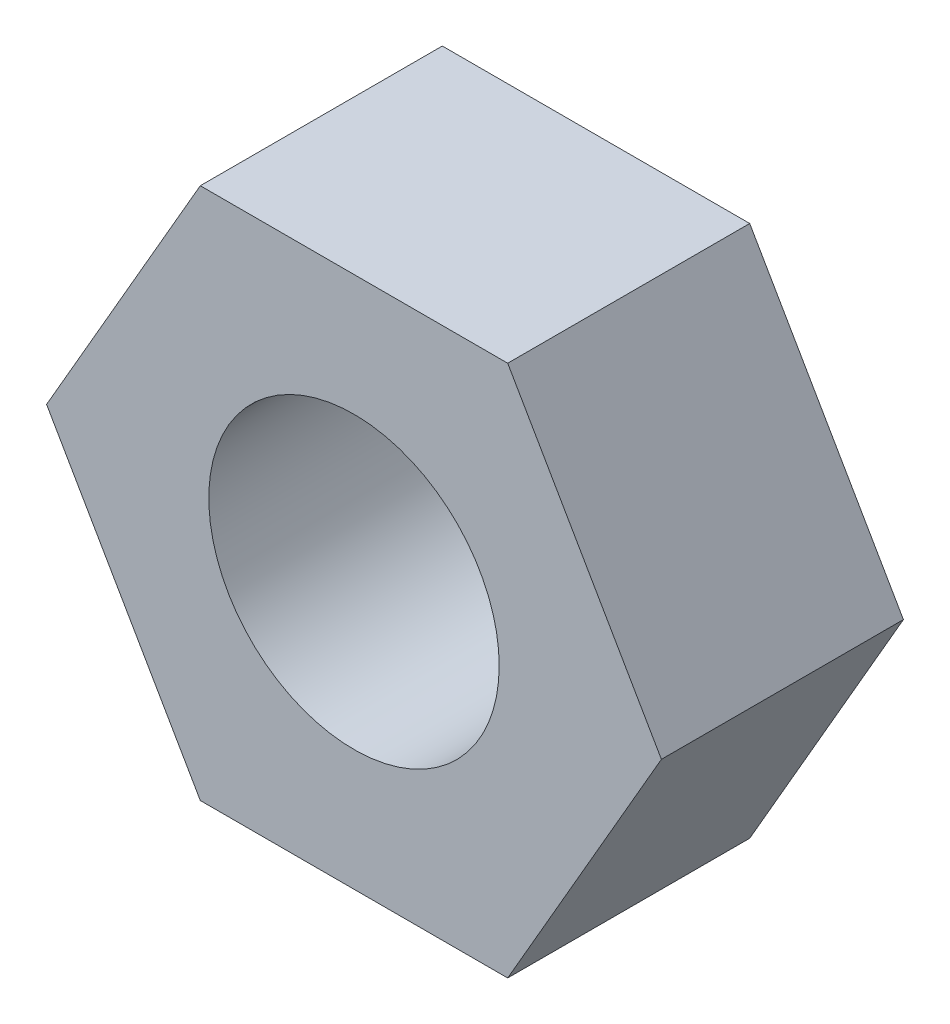
ISO-10303-21;
HEADER;
FILE_DESCRIPTION(('STEP AP214'),'2;1');
FILE_NAME('part.step','',(''),(''),'','','');
FILE_SCHEMA(('AUTOMOTIVE_DESIGN { 1 0 10303 214 1 1 1 1 }'));
ENDSEC;
DATA;
#1=APPLICATION_CONTEXT('core data for automotive mechanical design processes');
#2=APPLICATION_PROTOCOL_DEFINITION('international standard','automotive_design',2000,#1);
#3=PRODUCT_CONTEXT('',#1,'mechanical');
#4=PRODUCT('Part','Part','',(#3));
#5=PRODUCT_RELATED_PRODUCT_CATEGORY('part','',(#4));
#6=PRODUCT_DEFINITION_FORMATION('','',#4);
#7=PRODUCT_DEFINITION_CONTEXT('part definition',#1,'design');
#8=PRODUCT_DEFINITION('design','',#6,#7);
#9=PRODUCT_DEFINITION_SHAPE('','',#8);
#10=(LENGTH_UNIT() NAMED_UNIT(*) SI_UNIT(.MILLI.,.METRE.));
#11=(NAMED_UNIT(*) PLANE_ANGLE_UNIT() SI_UNIT($,.RADIAN.));
#12=(NAMED_UNIT(*) SI_UNIT($,.STERADIAN.) SOLID_ANGLE_UNIT());
#13=UNCERTAINTY_MEASURE_WITH_UNIT(LENGTH_MEASURE(1.E-05),#10,'distance_accuracy_value','');
#14=(GEOMETRIC_REPRESENTATION_CONTEXT(3) GLOBAL_UNCERTAINTY_ASSIGNED_CONTEXT((#13)) GLOBAL_UNIT_ASSIGNED_CONTEXT((#10,
#11,#12)) REPRESENTATION_CONTEXT('',''));
#15=CARTESIAN_POINT('',(0.,0.,0.));
#16=DIRECTION('',(0.,0.,1.));
#17=DIRECTION('',(1.,0.,0.));
#18=AXIS2_PLACEMENT_3D('',#15,#16,#17);
#19=CARTESIAN_POINT('',(0.,0.,2.5));
#20=DIRECTION('',(0.,0.,1.));
#21=DIRECTION('',(1.,0.,0.));
#22=AXIS2_PLACEMENT_3D('',#19,#20,#21);
#23=PLANE('',#22);
#24=DIRECTION('',(1.,0.,0.));
#25=VECTOR('',#24,1.);
#26=CARTESIAN_POINT('',(-1.58771324027147,-2.75,2.5));
#27=LINE('',#26,#25);
#28=CARTESIAN_POINT('',(-1.58771324027147,-2.75,2.5));
#29=VERTEX_POINT('',#28);
#30=CARTESIAN_POINT('',(1.58771324027147,-2.75,2.5));
#31=VERTEX_POINT('',#30);
#32=EDGE_CURVE('E129',#29,#31,#27,.T.);
#33=ORIENTED_EDGE('',*,*,#32,.T.);
#34=DIRECTION('',(0.5,0.866025403784439,0.));
#35=VECTOR('',#34,1.);
#36=CARTESIAN_POINT('',(1.58771324027147,-2.75,2.5));
#37=LINE('',#36,#35);
#38=CARTESIAN_POINT('',(3.17542648054294,0.,2.5));
#39=VERTEX_POINT('',#38);
#40=EDGE_CURVE('E87',#31,#39,#37,.T.);
#41=ORIENTED_EDGE('',*,*,#40,.T.);
#42=DIRECTION('',(-0.5,0.866025403784438,0.));
#43=VECTOR('',#42,1.);
#44=CARTESIAN_POINT('',(3.17542648054294,0.,2.5));
#45=LINE('',#44,#43);
#46=CARTESIAN_POINT('',(1.58771324027147,2.75,2.5));
#47=VERTEX_POINT('',#46);
#48=EDGE_CURVE('E100',#39,#47,#45,.T.);
#49=ORIENTED_EDGE('',*,*,#48,.T.);
#50=DIRECTION('',(-1.,0.,0.));
#51=VECTOR('',#50,1.);
#52=CARTESIAN_POINT('',(1.58771324027147,2.75,2.5));
#53=LINE('',#52,#51);
#54=CARTESIAN_POINT('',(-1.58771324027147,2.75,2.5));
#55=VERTEX_POINT('',#54);
#56=EDGE_CURVE('E94',#47,#55,#53,.T.);
#57=ORIENTED_EDGE('',*,*,#56,.T.);
#58=DIRECTION('',(-0.5,-0.866025403784438,0.));
#59=VECTOR('',#58,1.);
#60=CARTESIAN_POINT('',(-1.58771324027147,2.75,2.5));
#61=LINE('',#60,#59);
#62=CARTESIAN_POINT('',(-3.17542648054294,0.,2.5));
#63=VERTEX_POINT('',#62);
#64=EDGE_CURVE('E98',#55,#63,#61,.T.);
#65=ORIENTED_EDGE('',*,*,#64,.T.);
#66=DIRECTION('',(0.5,-0.866025403784438,0.));
#67=VECTOR('',#66,1.);
#68=CARTESIAN_POINT('',(-3.17542648054294,0.,2.5));
#69=LINE('',#68,#67);
#70=EDGE_CURVE('E50',#63,#29,#69,.T.);
#71=ORIENTED_EDGE('',*,*,#70,.T.);
#72=EDGE_LOOP('',(#33,#41,#49,#57,#65,#71));
#73=FACE_BOUND('',#72,.T.);
#74=CARTESIAN_POINT('',(0.,0.,2.5));
#75=DIRECTION('',(0.,0.,1.));
#76=DIRECTION('',(1.,0.,0.));
#77=AXIS2_PLACEMENT_3D('',#74,#75,#76);
#78=CIRCLE('',#77,1.5);
#79=CARTESIAN_POINT('',(1.5,0.,2.5));
#80=VERTEX_POINT('',#79);
#81=EDGE_CURVE('E122',#80,#80,#78,.T.);
#82=ORIENTED_EDGE('',*,*,#81,.F.);
#83=EDGE_LOOP('',(#82));
#84=FACE_BOUND('',#83,.T.);
#85=ADVANCED_FACE('F33',(#73,#84),#23,.T.);
#86=CARTESIAN_POINT('',(0.,0.,0.));
#87=DIRECTION('',(0.,0.,1.));
#88=DIRECTION('',(1.,0.,0.));
#89=AXIS2_PLACEMENT_3D('',#86,#87,#88);
#90=PLANE('',#89);
#91=DIRECTION('',(1.,0.,0.));
#92=VECTOR('',#91,1.);
#93=CARTESIAN_POINT('',(-1.58771324027147,-2.75,0.));
#94=LINE('',#93,#92);
#95=CARTESIAN_POINT('',(-1.58771324027147,-2.75,0.));
#96=VERTEX_POINT('',#95);
#97=CARTESIAN_POINT('',(1.58771324027147,-2.75,0.));
#98=VERTEX_POINT('',#97);
#99=EDGE_CURVE('E118',#96,#98,#94,.T.);
#100=ORIENTED_EDGE('',*,*,#99,.F.);
#101=DIRECTION('',(0.5,-0.866025403784438,0.));
#102=VECTOR('',#101,1.);
#103=CARTESIAN_POINT('',(-3.17542648054294,0.,0.));
#104=LINE('',#103,#102);
#105=CARTESIAN_POINT('',(-3.17542648054294,0.,0.));
#106=VERTEX_POINT('',#105);
#107=EDGE_CURVE('E79',#106,#96,#104,.T.);
#108=ORIENTED_EDGE('',*,*,#107,.F.);
#109=DIRECTION('',(-0.5,-0.866025403784438,0.));
#110=VECTOR('',#109,1.);
#111=CARTESIAN_POINT('',(-1.58771324027147,2.75,0.));
#112=LINE('',#111,#110);
#113=CARTESIAN_POINT('',(-1.58771324027147,2.75,0.));
#114=VERTEX_POINT('',#113);
#115=EDGE_CURVE('E73',#114,#106,#112,.T.);
#116=ORIENTED_EDGE('',*,*,#115,.F.);
#117=DIRECTION('',(-1.,0.,0.));
#118=VECTOR('',#117,1.);
#119=CARTESIAN_POINT('',(1.58771324027147,2.75,0.));
#120=LINE('',#119,#118);
#121=CARTESIAN_POINT('',(1.58771324027147,2.75,0.));
#122=VERTEX_POINT('',#121);
#123=EDGE_CURVE('E108',#122,#114,#120,.T.);
#124=ORIENTED_EDGE('',*,*,#123,.F.);
#125=DIRECTION('',(-0.5,0.866025403784438,0.));
#126=VECTOR('',#125,1.);
#127=CARTESIAN_POINT('',(3.17542648054294,0.,0.));
#128=LINE('',#127,#126);
#129=CARTESIAN_POINT('',(3.17542648054294,0.,0.));
#130=VERTEX_POINT('',#129);
#131=EDGE_CURVE('E124',#130,#122,#128,.T.);
#132=ORIENTED_EDGE('',*,*,#131,.F.);
#133=DIRECTION('',(0.5,0.866025403784439,0.));
#134=VECTOR('',#133,1.);
#135=CARTESIAN_POINT('',(1.58771324027147,-2.75,0.));
#136=LINE('',#135,#134);
#137=EDGE_CURVE('E121',#98,#130,#136,.T.);
#138=ORIENTED_EDGE('',*,*,#137,.F.);
#139=EDGE_LOOP('',(#100,#108,#116,#124,#132,#138));
#140=FACE_BOUND('',#139,.T.);
#141=CARTESIAN_POINT('',(0.,0.,0.));
#142=DIRECTION('',(0.,0.,1.));
#143=DIRECTION('',(1.,0.,0.));
#144=AXIS2_PLACEMENT_3D('',#141,#142,#143);
#145=CIRCLE('',#144,1.5);
#146=CARTESIAN_POINT('',(1.5,0.,0.));
#147=VERTEX_POINT('',#146);
#148=EDGE_CURVE('E222',#147,#147,#145,.T.);
#149=ORIENTED_EDGE('',*,*,#148,.T.);
#150=EDGE_LOOP('',(#149));
#151=FACE_BOUND('',#150,.T.);
#152=ADVANCED_FACE('F138',(#140,#151),#90,.F.);
#153=CARTESIAN_POINT('',(-1.58771324027147,-2.75,2.5));
#154=DIRECTION('',(0.,1.,0.));
#155=DIRECTION('',(-1.,0.,0.));
#156=AXIS2_PLACEMENT_3D('',#153,#154,#155);
#157=PLANE('',#156);
#158=ORIENTED_EDGE('',*,*,#99,.T.);
#159=DIRECTION('',(0.,0.,-1.));
#160=VECTOR('',#159,1.);
#161=CARTESIAN_POINT('',(1.58771324027147,-2.75,2.5));
#162=LINE('',#161,#160);
#163=EDGE_CURVE('E11',#31,#98,#162,.T.);
#164=ORIENTED_EDGE('',*,*,#163,.F.);
#165=ORIENTED_EDGE('',*,*,#32,.F.);
#166=DIRECTION('',(0.,0.,-1.));
#167=VECTOR('',#166,1.);
#168=CARTESIAN_POINT('',(-1.58771324027147,-2.75,2.5));
#169=LINE('',#168,#167);
#170=EDGE_CURVE('E114',#29,#96,#169,.T.);
#171=ORIENTED_EDGE('',*,*,#170,.T.);
#172=EDGE_LOOP('',(#158,#164,#165,#171));
#173=FACE_BOUND('',#172,.T.);
#174=ADVANCED_FACE('F35',(#173),#157,.F.);
#175=CARTESIAN_POINT('',(1.58771324027147,-2.75,2.5));
#176=DIRECTION('',(-0.866025403784439,0.5,0.));
#177=DIRECTION('',(-0.5,-0.866025403784439,0.));
#178=AXIS2_PLACEMENT_3D('',#175,#176,#177);
#179=PLANE('',#178);
#180=ORIENTED_EDGE('',*,*,#137,.T.);
#181=DIRECTION('',(0.,0.,-1.));
#182=VECTOR('',#181,1.);
#183=CARTESIAN_POINT('',(3.17542648054294,0.,2.5));
#184=LINE('',#183,#182);
#185=EDGE_CURVE('E42',#39,#130,#184,.T.);
#186=ORIENTED_EDGE('',*,*,#185,.F.);
#187=ORIENTED_EDGE('',*,*,#40,.F.);
#188=ORIENTED_EDGE('',*,*,#163,.T.);
#189=EDGE_LOOP('',(#180,#186,#187,#188));
#190=FACE_BOUND('',#189,.T.);
#191=ADVANCED_FACE('F163',(#190),#179,.F.);
#192=CARTESIAN_POINT('',(3.17542648054294,0.,2.5));
#193=DIRECTION('',(-0.866025403784438,-0.5,0.));
#194=DIRECTION('',(0.5,-0.866025403784438,0.));
#195=AXIS2_PLACEMENT_3D('',#192,#193,#194);
#196=PLANE('',#195);
#197=ORIENTED_EDGE('',*,*,#131,.T.);
#198=DIRECTION('',(0.,0.,-1.));
#199=VECTOR('',#198,1.);
#200=CARTESIAN_POINT('',(1.58771324027147,2.75,2.5));
#201=LINE('',#200,#199);
#202=EDGE_CURVE('E109',#47,#122,#201,.T.);
#203=ORIENTED_EDGE('',*,*,#202,.F.);
#204=ORIENTED_EDGE('',*,*,#48,.F.);
#205=ORIENTED_EDGE('',*,*,#185,.T.);
#206=EDGE_LOOP('',(#197,#203,#204,#205));
#207=FACE_BOUND('',#206,.T.);
#208=ADVANCED_FACE('F135',(#207),#196,.F.);
#209=CARTESIAN_POINT('',(1.58771324027147,2.75,2.5));
#210=DIRECTION('',(0.,-1.,0.));
#211=DIRECTION('',(0.,0.,-1.));
#212=AXIS2_PLACEMENT_3D('',#209,#210,#211);
#213=PLANE('',#212);
#214=ORIENTED_EDGE('',*,*,#123,.T.);
#215=DIRECTION('',(0.,0.,-1.));
#216=VECTOR('',#215,1.);
#217=CARTESIAN_POINT('',(-1.58771324027147,2.75,2.5));
#218=LINE('',#217,#216);
#219=EDGE_CURVE('E105',#55,#114,#218,.T.);
#220=ORIENTED_EDGE('',*,*,#219,.F.);
#221=ORIENTED_EDGE('',*,*,#56,.F.);
#222=ORIENTED_EDGE('',*,*,#202,.T.);
#223=EDGE_LOOP('',(#214,#220,#221,#222));
#224=FACE_BOUND('',#223,.T.);
#225=ADVANCED_FACE('F106',(#224),#213,.F.);
#226=CARTESIAN_POINT('',(-1.58771324027147,2.75,2.5));
#227=DIRECTION('',(0.866025403784439,-0.5,0.));
#228=DIRECTION('',(0.5,0.866025403784439,0.));
#229=AXIS2_PLACEMENT_3D('',#226,#227,#228);
#230=PLANE('',#229);
#231=ORIENTED_EDGE('',*,*,#115,.T.);
#232=DIRECTION('',(0.,0.,-1.));
#233=VECTOR('',#232,1.);
#234=CARTESIAN_POINT('',(-3.17542648054294,0.,2.5));
#235=LINE('',#234,#233);
#236=EDGE_CURVE('E110',#63,#106,#235,.T.);
#237=ORIENTED_EDGE('',*,*,#236,.F.);
#238=ORIENTED_EDGE('',*,*,#64,.F.);
#239=ORIENTED_EDGE('',*,*,#219,.T.);
#240=EDGE_LOOP('',(#231,#237,#238,#239));
#241=FACE_BOUND('',#240,.T.);
#242=ADVANCED_FACE('F112',(#241),#230,.F.);
#243=CARTESIAN_POINT('',(-3.17542648054294,0.,2.5));
#244=DIRECTION('',(0.866025403784438,0.5,0.));
#245=DIRECTION('',(-0.5,0.866025403784438,0.));
#246=AXIS2_PLACEMENT_3D('',#243,#244,#245);
#247=PLANE('',#246);
#248=ORIENTED_EDGE('',*,*,#107,.T.);
#249=ORIENTED_EDGE('',*,*,#170,.F.);
#250=ORIENTED_EDGE('',*,*,#70,.F.);
#251=ORIENTED_EDGE('',*,*,#236,.T.);
#252=EDGE_LOOP('',(#248,#249,#250,#251));
#253=FACE_BOUND('',#252,.T.);
#254=ADVANCED_FACE('F143',(#253),#247,.F.);
#255=CARTESIAN_POINT('',(0.,0.,2.5));
#256=DIRECTION('',(0.,0.,-1.));
#257=DIRECTION('',(-1.,0.,0.));
#258=AXIS2_PLACEMENT_3D('',#255,#256,#257);
#259=CYLINDRICAL_SURFACE('',#258,1.5);
#260=ORIENTED_EDGE('',*,*,#81,.T.);
#261=EDGE_LOOP('',(#260));
#262=FACE_BOUND('',#261,.T.);
#263=ORIENTED_EDGE('',*,*,#148,.F.);
#264=EDGE_LOOP('',(#263));
#265=FACE_BOUND('',#264,.T.);
#266=ADVANCED_FACE('F145',(#262,#265),#259,.F.);
#267=CLOSED_SHELL('',(#85,#152,#174,#191,#208,#225,#242,#254,#266));
#268=MANIFOLD_SOLID_BREP('B2',#267);
#269=ADVANCED_BREP_SHAPE_REPRESENTATION('',(#18,#268),#14);
#270=SHAPE_DEFINITION_REPRESENTATION(#9,#269);
ENDSEC;
END-ISO-10303-21;
